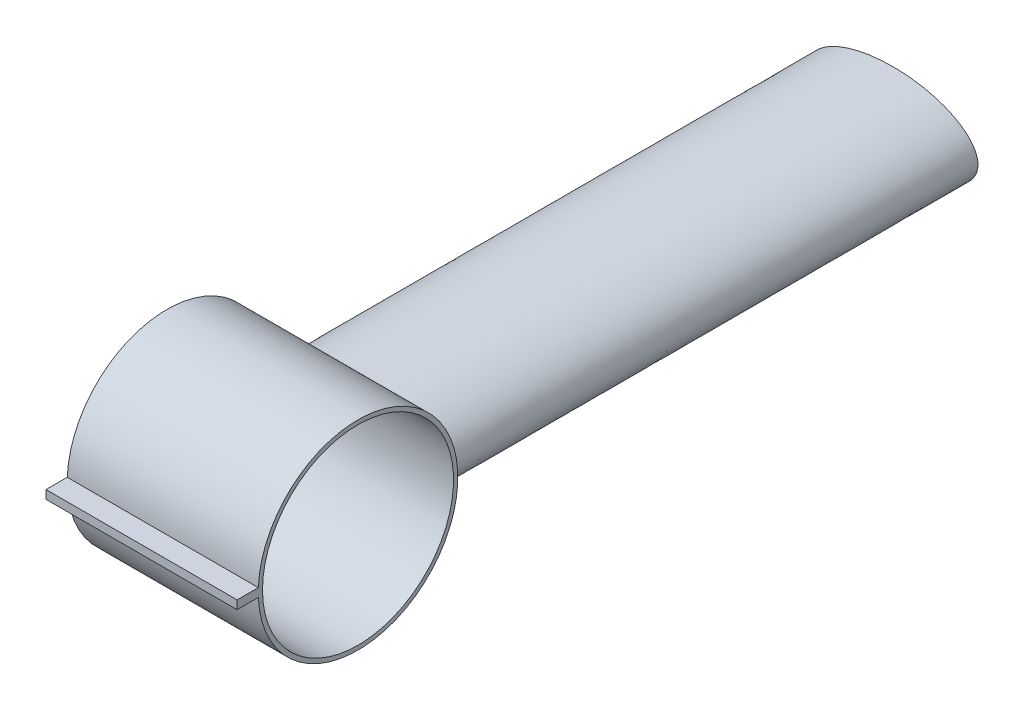
ISO-10303-21;
HEADER;
FILE_DESCRIPTION(('STEP AP214'),'2;1');
FILE_NAME('part.step','',(''),(''),'','','');
FILE_SCHEMA(('AUTOMOTIVE_DESIGN { 1 0 10303 214 1 1 1 1 }'));
ENDSEC;
DATA;
#1=APPLICATION_CONTEXT('core data for automotive mechanical design processes');
#2=APPLICATION_PROTOCOL_DEFINITION('international standard','automotive_design',2000,#1);
#3=PRODUCT_CONTEXT('',#1,'mechanical');
#4=PRODUCT('Part','Part','',(#3));
#5=PRODUCT_RELATED_PRODUCT_CATEGORY('part','',(#4));
#6=PRODUCT_DEFINITION_FORMATION('','',#4);
#7=PRODUCT_DEFINITION_CONTEXT('part definition',#1,'design');
#8=PRODUCT_DEFINITION('design','',#6,#7);
#9=PRODUCT_DEFINITION_SHAPE('','',#8);
#10=(LENGTH_UNIT() NAMED_UNIT(*) SI_UNIT(.MILLI.,.METRE.));
#11=(NAMED_UNIT(*) PLANE_ANGLE_UNIT() SI_UNIT($,.RADIAN.));
#12=(NAMED_UNIT(*) SI_UNIT($,.STERADIAN.) SOLID_ANGLE_UNIT());
#13=UNCERTAINTY_MEASURE_WITH_UNIT(LENGTH_MEASURE(1.E-05),#10,'distance_accuracy_value','');
#14=(GEOMETRIC_REPRESENTATION_CONTEXT(3) GLOBAL_UNCERTAINTY_ASSIGNED_CONTEXT((#13)) GLOBAL_UNIT_ASSIGNED_CONTEXT((#10,
#11,#12)) REPRESENTATION_CONTEXT('',''));
#15=CARTESIAN_POINT('',(0.,0.,0.));
#16=DIRECTION('',(0.,0.,1.));
#17=DIRECTION('',(1.,0.,0.));
#18=AXIS2_PLACEMENT_3D('',#15,#16,#17);
#19=CARTESIAN_POINT('',(90.,0.,0.));
#20=DIRECTION('',(-1.,0.,0.));
#21=DIRECTION('',(0.,0.,1.));
#22=AXIS2_PLACEMENT_3D('',#19,#20,#21);
#23=CYLINDRICAL_SURFACE('',#22,47.);
#24=CARTESIAN_POINT('',(0.,0.,0.));
#25=DIRECTION('',(1.,0.,0.));
#26=DIRECTION('',(0.,0.,-1.));
#27=AXIS2_PLACEMENT_3D('',#24,#25,#26);
#28=CIRCLE('',#27,47.);
#29=CARTESIAN_POINT('',(0.,-2.,46.9574275274956));
#30=VERTEX_POINT('',#29);
#31=CARTESIAN_POINT('',(0.,2.,46.9574275274956));
#32=VERTEX_POINT('',#31);
#33=EDGE_CURVE('E108',#30,#32,#28,.T.);
#34=ORIENTED_EDGE('',*,*,#33,.T.);
#35=DIRECTION('',(-1.,0.,0.));
#36=VECTOR('',#35,1.);
#37=CARTESIAN_POINT('',(90.,2.,46.9574275274956));
#38=LINE('',#37,#36);
#39=CARTESIAN_POINT('',(90.,2.,46.9574275274956));
#40=VERTEX_POINT('',#39);
#41=EDGE_CURVE('E49',#40,#32,#38,.T.);
#42=ORIENTED_EDGE('',*,*,#41,.F.);
#43=CARTESIAN_POINT('',(90.,0.,0.));
#44=DIRECTION('',(1.,0.,0.));
#45=DIRECTION('',(0.,0.,-1.));
#46=AXIS2_PLACEMENT_3D('',#43,#44,#45);
#47=CIRCLE('',#46,47.);
#48=CARTESIAN_POINT('',(90.,-2.,46.9574275274956));
#49=VERTEX_POINT('',#48);
#50=EDGE_CURVE('E94',#49,#40,#47,.T.);
#51=ORIENTED_EDGE('',*,*,#50,.F.);
#52=DIRECTION('',(-1.,0.,0.));
#53=VECTOR('',#52,1.);
#54=CARTESIAN_POINT('',(90.,-2.,46.9574275274956));
#55=LINE('',#54,#53);
#56=EDGE_CURVE('E104',#49,#30,#55,.T.);
#57=ORIENTED_EDGE('',*,*,#56,.T.);
#58=EDGE_LOOP('',(#34,#42,#51,#57));
#59=FACE_BOUND('',#58,.T.);
#60=CARTESIAN_POINT('',(85.,0.,-46.9999999999999));
#61=CARTESIAN_POINT('',(84.9999944265862,-0.301563655619714,-46.999998647965));
#62=CARTESIAN_POINT('',(84.9863196660827,-0.603234906000948,-46.9970880240753));
#63=CARTESIAN_POINT('',(84.9319724113565,-1.20415215406946,-46.9855345832595));
#64=CARTESIAN_POINT('',(84.8912821664189,-1.50339642615125,-46.9768879974824));
#65=CARTESIAN_POINT('',(84.7838668525855,-2.09766698661284,-46.9541097764554));
#66=CARTESIAN_POINT('',(84.7170809497501,-2.3926817369566,-46.9399653250412));
#67=CARTESIAN_POINT('',(84.5591106832612,-2.9758711455107,-46.9066043510303));
#68=CARTESIAN_POINT('',(84.46792021576,-3.26404407284864,-46.8873865595525));
#69=CARTESIAN_POINT('',(84.303352538782,-3.72053875255807,-46.8528290170653));
#70=CARTESIAN_POINT('',(84.2370100828878,-3.89155075866,-46.8389231696243));
#71=CARTESIAN_POINT('',(84.0965784497248,-4.23016253992002,-46.8095566530616));
#72=CARTESIAN_POINT('',(84.0224915911777,-4.39776331856755,-46.7940964493764));
#73=CARTESIAN_POINT('',(83.789264746442,-4.89533263871132,-46.74555347853));
#74=CARTESIAN_POINT('',(83.6191780360842,-5.22001465080256,-46.7103124691645));
#75=CARTESIAN_POINT('',(83.2535880656008,-5.85448119775654,-46.6350438269013));
#76=CARTESIAN_POINT('',(83.0580567918436,-6.16424878962639,-46.5950109222363));
#77=CARTESIAN_POINT('',(82.6452708087519,-6.7683281982984,-46.5111030147711));
#78=CARTESIAN_POINT('',(82.4280153488206,-7.06263948053015,-46.4672278792238));
#79=CARTESIAN_POINT('',(81.8473011294639,-7.79752765725764,-46.3508861544172));
#80=CARTESIAN_POINT('',(81.4703972767928,-8.22715679242265,-46.2762305053962));
#81=CARTESIAN_POINT('',(80.6809048959677,-9.05136741753008,-46.1221060667032));
#82=CARTESIAN_POINT('',(80.2682940315846,-9.44592665241122,-46.0426342737836));
#83=CARTESIAN_POINT('',(79.4142972707297,-10.2030966727877,-45.8807897407124));
#84=CARTESIAN_POINT('',(78.9728687398904,-10.5656581661585,-45.7984127892658));
#85=CARTESIAN_POINT('',(78.0675430521334,-11.2608348342972,-45.6324583833334));
#86=CARTESIAN_POINT('',(77.6036508639298,-11.5934565852949,-45.5488811971774));
#87=CARTESIAN_POINT('',(76.6992477714326,-12.2032982750446,-45.3890939134366));
#88=CARTESIAN_POINT('',(76.2602776850182,-12.482817424423,-45.3128834888917));
#89=CARTESIAN_POINT('',(75.3695971535917,-13.0209005759869,-45.1612032329883));
#90=CARTESIAN_POINT('',(74.9178868497776,-13.2794648102902,-45.0857333934345));
#91=CARTESIAN_POINT('',(74.0043224660932,-13.7768341342886,-44.9362455205899));
#92=CARTESIAN_POINT('',(73.5424828847854,-14.015665396096,-44.8622256669671));
#93=CARTESIAN_POINT('',(72.6096507936094,-14.4752887971383,-44.7160391586225));
#94=CARTESIAN_POINT('',(72.1386583092602,-14.6960809866587,-44.6438724987352));
#95=CARTESIAN_POINT('',(71.1897387085177,-15.1203661240045,-44.501960168481));
#96=CARTESIAN_POINT('',(70.7118270841602,-15.323892299951,-44.4322100081227));
#97=CARTESIAN_POINT('',(69.7492168752385,-15.7151276689841,-44.2953462490476));
#98=CARTESIAN_POINT('',(69.2645183081528,-15.9028369027957,-44.2282326435425));
#99=CARTESIAN_POINT('',(68.289105471902,-16.2633443494362,-44.0969437426596));
#100=CARTESIAN_POINT('',(67.7983899810034,-16.4361394747234,-44.0327690569861));
#101=CARTESIAN_POINT('',(66.8117686373278,-16.767526542864,-43.907645787306));
#102=CARTESIAN_POINT('',(66.3158624789701,-16.9261176441971,-43.8466973945293));
#103=CARTESIAN_POINT('',(64.8223753788509,-17.3812629060408,-43.6691899197874));
#104=CARTESIAN_POINT('',(63.8179457045932,-17.6575840773785,-43.5578224380648));
#105=CARTESIAN_POINT('',(61.7953423661313,-18.1603364126266,-43.3506154251185));
#106=CARTESIAN_POINT('',(60.7771700397561,-18.3867723961468,-43.2547743940587));
#107=CARTESIAN_POINT('',(58.7304944457843,-18.7928515155357,-43.0798974695963));
#108=CARTESIAN_POINT('',(57.7019948083554,-18.9725105345726,-43.0008558736066));
#109=CARTESIAN_POINT('',(55.6370112837329,-19.2874254122677,-42.8605283531815));
#110=CARTESIAN_POINT('',(54.6005270946483,-19.4226795834887,-42.799243103519));
#111=CARTESIAN_POINT('',(52.5220983357085,-19.6503792243847,-42.6951782080631));
#112=CARTESIAN_POINT('',(51.4801545026222,-19.7428303270772,-42.6523961272438));
#113=CARTESIAN_POINT('',(49.3929001044184,-19.8859997197747,-42.5858337295517));
#114=CARTESIAN_POINT('',(48.3475898403832,-19.9367216432469,-42.5620517582958));
#115=CARTESIAN_POINT('',(46.2556848019515,-19.9970042741981,-42.533762089118));
#116=CARTESIAN_POINT('',(45.2090902421753,-20.0065711141222,-42.5292515196));
#117=CARTESIAN_POINT('',(43.1161047473502,-19.9846623886487,-42.5395514750415));
#118=CARTESIAN_POINT('',(42.0697139658566,-19.9531745950618,-42.5543677565357));
#119=CARTESIAN_POINT('',(40.0805382431487,-19.8538341994039,-42.6007970654668));
#120=CARTESIAN_POINT('',(39.1375198598298,-19.7897927528591,-42.6306471911613));
#121=CARTESIAN_POINT('',(37.2549493320413,-19.627319981738,-42.7056945612138));
#122=CARTESIAN_POINT('',(36.3153975562865,-19.5288850998363,-42.7508933930804));
#123=CARTESIAN_POINT('',(34.4416184294367,-19.296710730194,-42.856192227448));
#124=CARTESIAN_POINT('',(33.5073903960814,-19.1629758751991,-42.9162902745228));
#125=CARTESIAN_POINT('',(31.6460556264533,-18.8588887405685,-43.05078371983));
#126=CARTESIAN_POINT('',(30.7189479532335,-18.6885413672316,-43.1251772022463));
#127=CARTESIAN_POINT('',(28.8763025166564,-18.3099424285319,-43.2872767436755));
#128=CARTESIAN_POINT('',(27.9607401082314,-18.1017954254721,-43.3749459705162));
#129=CARTESIAN_POINT('',(26.1412922855269,-17.6450083537636,-43.5627674773164));
#130=CARTESIAN_POINT('',(25.237403663801,-17.3963796746619,-43.6629162442943));
#131=CARTESIAN_POINT('',(23.4436447284929,-16.8554240678432,-43.8745839509887));
#132=CARTESIAN_POINT('',(22.5537810696166,-16.5630770475728,-43.9861081112006));
#133=CARTESIAN_POINT('',(20.7919419108967,-15.9306855708834,-44.219081028129));
#134=CARTESIAN_POINT('',(19.9199727433205,-15.5906245526439,-44.3405332247917));
#135=CARTESIAN_POINT('',(18.6291283828523,-15.0407502596886,-44.5287907073854));
#136=CARTESIAN_POINT('',(18.2013544978157,-14.8506559954554,-44.5926112745526));
#137=CARTESIAN_POINT('',(17.3525894134621,-14.4564548155555,-44.7219634369799));
#138=CARTESIAN_POINT('',(16.9315976667167,-14.2523490379124,-44.7874948930133));
#139=CARTESIAN_POINT('',(16.0977328981988,-13.8294191774562,-44.9198865978773));
#140=CARTESIAN_POINT('',(15.6848532921317,-13.6106077273254,-44.9867456723102));
#141=CARTESIAN_POINT('',(14.8680592216682,-13.1571143900099,-45.1214617932154));
#142=CARTESIAN_POINT('',(14.4641443853015,-12.9224331629424,-45.189318798086));
#143=CARTESIAN_POINT('',(13.7510140223661,-12.4874618102998,-45.3111789905805));
#144=CARTESIAN_POINT('',(13.4398218028596,-12.2903823139684,-45.3650799469686));
#145=CARTESIAN_POINT('',(12.8248265849565,-11.8850440259567,-45.4729559261328));
#146=CARTESIAN_POINT('',(12.5210231665271,-11.6767858719206,-45.5269309445137));
#147=CARTESIAN_POINT('',(11.9210296132352,-11.2478491210567,-45.6347995722824));
#148=CARTESIAN_POINT('',(11.6248617898409,-11.027139069104,-45.6886925867851));
#149=CARTESIAN_POINT('',(11.0422523442742,-10.5731067684566,-45.7958928894538));
#150=CARTESIAN_POINT('',(10.7558106413056,-10.3397846245739,-45.849200182483));
#151=CARTESIAN_POINT('',(10.0632816104712,-9.74795614221255,-45.9794220510677));
#152=CARTESIAN_POINT('',(9.66358921844953,-9.38174824759422,-46.0557709558769));
#153=CARTESIAN_POINT('',(8.89399372579378,-8.61812012338825,-46.2047554832693));
#154=CARTESIAN_POINT('',(8.52410263356,-8.2206874379543,-46.2773896047218));
#155=CARTESIAN_POINT('',(7.82308153897583,-7.39391098036452,-46.4166464457637));
#156=CARTESIAN_POINT('',(7.49182268378777,-6.96468158193644,-46.4832889685902));
#157=CARTESIAN_POINT('',(7.03062213520065,-6.29580251239599,-46.5769627320162));
#158=CARTESIAN_POINT('',(6.8828858529593,-6.06876118435615,-46.6071287321936));
#159=CARTESIAN_POINT('',(6.60059371848166,-5.60623454909547,-46.6650239964002));
#160=CARTESIAN_POINT('',(6.46603987009428,-5.37074796552863,-46.6927528899015));
#161=CARTESIAN_POINT('',(6.19868066521406,-4.86713634476318,-46.7480643520269));
#162=CARTESIAN_POINT('',(6.06745638704886,-4.59813368406514,-46.7753429408536));
#163=CARTESIAN_POINT('',(5.82509143819001,-4.05094018046567,-46.8259044937399));
#164=CARTESIAN_POINT('',(5.71394350682806,-3.7727527025043,-46.8491889021524));
#165=CARTESIAN_POINT('',(5.51387938018982,-3.20836671394953,-46.8912184565973));
#166=CARTESIAN_POINT('',(5.42494563589765,-2.92217472688286,-46.9099671854062));
#167=CARTESIAN_POINT('',(5.27115354708127,-2.34307254180351,-46.9424551125821));
#168=CARTESIAN_POINT('',(5.20629557742695,-2.05016223925925,-46.9561942329472));
#169=CARTESIAN_POINT('',(5.10189599123534,-1.45753232932346,-46.9783365993622));
#170=CARTESIAN_POINT('',(5.06253337973429,-1.15777955354597,-46.9867021135614));
#171=CARTESIAN_POINT('',(5.01091196178863,-0.555832160531082,-46.9976770932727));
#172=CARTESIAN_POINT('',(4.99865285185167,-0.253637570673994,-47.0002866232376));
#173=CARTESIAN_POINT('',(5.00158235168595,0.350633079844731,-46.999663333517));
#174=CARTESIAN_POINT('',(5.01677305384105,0.652709129714993,-46.9964300684597));
#175=CARTESIAN_POINT('',(5.07418116164882,1.25414704007024,-46.984226981532));
#176=CARTESIAN_POINT('',(5.11639796031713,1.55350896135922,-46.9752572884971));
#177=CARTESIAN_POINT('',(5.22222562916041,2.12301890086996,-46.9528200775174));
#178=CARTESIAN_POINT('',(5.28381797589585,2.3935632197148,-46.939777550291));
#179=CARTESIAN_POINT('',(5.42754582839735,2.92884624929271,-46.9094204081563));
#180=CARTESIAN_POINT('',(5.50967962164193,3.1935854419936,-46.8921061493799));
#181=CARTESIAN_POINT('',(5.69296472942062,3.71613131705082,-46.8535914282553));
#182=CARTESIAN_POINT('',(5.79411950322668,3.97393672862355,-46.8323902590273));
#183=CARTESIAN_POINT('',(6.01377674482036,4.4817553027793,-46.7865248825737));
#184=CARTESIAN_POINT('',(6.13228359933625,4.7317664754809,-46.7618597997109));
#185=CARTESIAN_POINT('',(6.45293835440484,5.35568333277929,-46.6954085989936));
#186=CARTESIAN_POINT('',(6.66578926796066,5.72389732647068,-46.6515494021397));
#187=CARTESIAN_POINT('',(7.1227162028139,6.43965583717111,-46.5581495277265));
#188=CARTESIAN_POINT('',(7.36680739826118,6.78719018861029,-46.5086060904152));
#189=CARTESIAN_POINT('',(7.8816604876967,7.46244532951476,-46.4050521535883));
#190=CARTESIAN_POINT('',(8.15248589476895,7.79011579782679,-46.3510310676772));
#191=CARTESIAN_POINT('',(8.71593702508617,8.42540480563648,-46.2397724257602));
#192=CARTESIAN_POINT('',(9.00856175687655,8.73302425588236,-46.1825350160648));
#193=CARTESIAN_POINT('',(9.6501840838645,9.36692464708594,-46.0584175477217));
#194=CARTESIAN_POINT('',(10.0016338809383,9.69065605045628,-45.9912326097476));
#195=CARTESIAN_POINT('',(10.7237906879406,10.315800401187,-45.8550612759004));
#196=CARTESIAN_POINT('',(11.0945093348807,10.617199588632,-45.78607380423));
#197=CARTESIAN_POINT('',(11.8518897944212,11.1991624493137,-45.6472152519121));
#198=CARTESIAN_POINT('',(12.2385557301236,11.4797206810243,-45.5773439460315));
#199=CARTESIAN_POINT('',(13.0256965349272,12.0217844084078,-45.4373760646746));
#200=CARTESIAN_POINT('',(13.4261889081313,12.2832643429427,-45.3672793137466));
#201=CARTESIAN_POINT('',(14.2383147003795,12.7880633527231,-45.227579964549));
#202=CARTESIAN_POINT('',(14.649944218348,13.0313886776901,-45.1579772037594));
#203=CARTESIAN_POINT('',(15.482793313216,13.5011898087287,-45.0197488651226));
#204=CARTESIAN_POINT('',(15.9040121841435,13.727666849972,-44.9511232159407));
#205=CARTESIAN_POINT('',(16.9200242823341,14.2498490058054,-44.7888711624617));
#206=CARTESIAN_POINT('',(17.5186727736852,14.5382645504169,-44.6958903156502));
#207=CARTESIAN_POINT('',(18.7290608495913,15.0872897033071,-44.5135628558859));
#208=CARTESIAN_POINT('',(19.3408005743457,15.347899013618,-44.4242162818839));
#209=CARTESIAN_POINT('',(20.5743374108444,15.8430716282958,-44.2500378767813));
#210=CARTESIAN_POINT('',(21.1961194794342,16.0776703776113,-44.1651999858638));
#211=CARTESIAN_POINT('',(22.4488042607839,16.522969589079,-44.0005432127864));
#212=CARTESIAN_POINT('',(23.0797068906527,16.7336702682725,-43.9207242850475));
#213=CARTESIAN_POINT('',(24.3481612255445,17.1322919526873,-43.7667697094132));
#214=CARTESIAN_POINT('',(24.9857000665032,17.3202504138144,-43.6926247926859));
#215=CARTESIAN_POINT('',(26.2672882971595,17.674996010713,-43.5503275168762));
#216=CARTESIAN_POINT('',(26.9113376816431,17.8417831634382,-43.482175152995));
#217=CARTESIAN_POINT('',(28.2051249139284,18.1552264976946,-43.3522379299203));
#218=CARTESIAN_POINT('',(28.8548642169649,18.301877359194,-43.2904547545442));
#219=CARTESIAN_POINT('',(30.1590005639285,18.57582397977,-43.1736137592337));
#220=CARTESIAN_POINT('',(30.8133976026053,18.7031197606603,-43.1185559317197));
#221=CARTESIAN_POINT('',(32.1255563221577,18.9389437641581,-43.0154968788587));
#222=CARTESIAN_POINT('',(32.7833147860459,19.047487365648,-42.9674898759373));
#223=CARTESIAN_POINT('',(34.1020590447414,19.2464875424336,-42.878718460427));
#224=CARTESIAN_POINT('',(34.7630450072356,19.336943167489,-42.8379544283554));
#225=CARTESIAN_POINT('',(36.749679523769,19.5818399578881,-42.7268572880518));
#226=CARTESIAN_POINT('',(38.0793166200119,19.7098665293631,-42.6676944770313));
#227=CARTESIAN_POINT('',(40.7440403038467,19.8978431044334,-42.5803514692308));
#228=CARTESIAN_POINT('',(42.0791258475219,19.9578055861793,-42.5521655934971));
#229=CARTESIAN_POINT('',(44.7509971415528,20.0107817035076,-42.52727980944));
#230=CARTESIAN_POINT('',(46.087782960671,20.0037925394056,-42.5305812178049));
#231=CARTESIAN_POINT('',(48.7589274039557,19.9227318480772,-42.5686117885335));
#232=CARTESIAN_POINT('',(50.0932858861475,19.8486565158709,-42.6033427335111));
#233=CARTESIAN_POINT('',(52.7553039626024,19.6320784660389,-42.7035829246577));
#234=CARTESIAN_POINT('',(54.0829640597834,19.48958096523,-42.7690898243198));
#235=CARTESIAN_POINT('',(56.0659471913049,19.2224675548328,-42.8894619772112));
#236=CARTESIAN_POINT('',(56.7256400647823,19.1245130997297,-42.9332810697826));
#237=CARTESIAN_POINT('',(58.0415202882659,18.9102991386349,-43.028065231815));
#238=CARTESIAN_POINT('',(58.697707826454,18.7940406257071,-43.0790299135846));
#239=CARTESIAN_POINT('',(60.0061083667224,18.5425732271905,-43.1878656257211));
#240=CARTESIAN_POINT('',(60.6583198867429,18.4073576781657,-43.2457390834695));
#241=CARTESIAN_POINT('',(61.957741220228,18.1172660634488,-43.3680696339315));
#242=CARTESIAN_POINT('',(62.604951059628,17.9623900997754,-43.4325266924822));
#243=CARTESIAN_POINT('',(63.8943280469634,17.6318602285377,-43.5677568912269));
#244=CARTESIAN_POINT('',(64.5364872257761,17.4561786071491,-43.6385384243258));
#245=CARTESIAN_POINT('',(65.8138323479053,17.0831168051218,-43.785926529296));
#246=CARTESIAN_POINT('',(66.4490181089765,16.8857360588691,-43.8625332529919));
#247=CARTESIAN_POINT('',(67.7105627190323,16.4681670915734,-44.0210098290628));
#248=CARTESIAN_POINT('',(68.3369289248352,16.2479993375566,-44.1028749337687));
#249=CARTESIAN_POINT('',(69.5798470101852,15.783167453446,-44.271354081312));
#250=CARTESIAN_POINT('',(70.1963997144524,15.5385053945698,-44.3579677223375));
#251=CARTESIAN_POINT('',(71.1981539015811,15.1155428240997,-44.5033794447415));
#252=CARTESIAN_POINT('',(71.5868233192645,14.9450155504302,-44.5609800965924));
#253=CARTESIAN_POINT('',(72.358735826494,14.592573418742,-44.6776373169887));
#254=CARTESIAN_POINT('',(72.7419791534492,14.410659060845,-44.7366938215241));
#255=CARTESIAN_POINT('',(73.5030353813513,14.0344562536295,-44.856137448111));
#256=CARTESIAN_POINT('',(73.8808370921649,13.8401458220541,-44.9165268023613));
#257=CARTESIAN_POINT('',(74.6294059580879,13.4387446347058,-45.0382514779079));
#258=CARTESIAN_POINT('',(75.0001734418919,13.2316544780351,-45.0995867547591));
#259=CARTESIAN_POINT('',(75.9282195397603,12.690443429372,-45.2555953279917));
#260=CARTESIAN_POINT('',(76.4801585451454,12.3471866494633,-45.3507022645314));
#261=CARTESIAN_POINT('',(77.5608466019724,11.6254522328935,-45.5410607569906));
#262=CARTESIAN_POINT('',(78.0895878229079,11.2469628358707,-45.636312350684));
#263=CARTESIAN_POINT('',(79.1163976109515,10.4518592817083,-45.8249423910133));
#264=CARTESIAN_POINT('',(79.6145321701359,10.0353323364016,-45.9183245524131));
#265=CARTESIAN_POINT('',(80.3328442025743,9.3786770259833,-46.0552949258815));
#266=CARTESIAN_POINT('',(80.5674060551684,9.15454710559669,-46.1004225908469));
#267=CARTESIAN_POINT('',(81.025575483953,8.69513772606408,-46.1892775463559));
#268=CARTESIAN_POINT('',(81.2491825899653,8.45985778921003,-46.233004776765));
#269=CARTESIAN_POINT('',(81.9313402688018,7.70316416104641,-46.3673976626656));
#270=CARTESIAN_POINT('',(82.3679550186348,7.16057373124053,-46.4549042107713));
#271=CARTESIAN_POINT('',(82.9651223321636,6.30504933341354,-46.5760587523717));
#272=CARTESIAN_POINT('',(83.1546295620869,6.01278408120999,-46.6147755790589));
#273=CARTESIAN_POINT('',(83.5114383872639,5.41431118795536,-46.6880726824702));
#274=CARTESIAN_POINT('',(83.6787366641138,5.10810147251845,-46.7226523409533));
#275=CARTESIAN_POINT('',(83.9900386332564,4.47784434882617,-46.7872918499093));
#276=CARTESIAN_POINT('',(84.1336623946279,4.1536004737017,-46.8172775221503));
#277=CARTESIAN_POINT('',(84.3909285600107,3.49310822406991,-46.8711841269004));
#278=CARTESIAN_POINT('',(84.504589667649,3.15686748793626,-46.8951088424828));
#279=CARTESIAN_POINT('',(84.6983482640858,2.47550839918431,-46.9359965775623));
#280=CARTESIAN_POINT('',(84.778557305571,2.13042369247357,-46.9529827311371));
#281=CARTESIAN_POINT('',(84.8720339813861,1.60805918297868,-46.9728068703706));
#282=CARTESIAN_POINT('',(84.8987163943895,1.43319701450455,-46.9784716177523));
#283=CARTESIAN_POINT('',(84.9429371958676,1.08227272380438,-46.9878649715163));
#284=CARTESIAN_POINT('',(84.9604770410635,0.906210797272142,-46.991593886342));
#285=CARTESIAN_POINT('',(84.9822270615987,0.608397083952204,-46.9962190505169));
#286=CARTESIAN_POINT('',(84.9888881510003,0.486826458320001,-46.9976359885745));
#287=CARTESIAN_POINT('',(84.997775963221,0.243509746355741,-46.9995267825995));
#288=CARTESIAN_POINT('',(85.0000022504011,0.121763643961678,-47.0000005459169));
#289=CARTESIAN_POINT('',(85.,0.,-46.9999999999999));
#290=B_SPLINE_CURVE_WITH_KNOTS('',3,(#60,#61,#62,#63,#64,#65,#66,#67,#68,#69,#70,#71,#72,#73,
#74,#75,#76,#77,#78,#79,#80,#81,#82,#83,#84,#85,#86,#87,#88,#89,#90,#91,#92,#93,#94,#95,#96,#97,
#98,#99,#100,#101,#102,#103,#104,#105,#106,#107,#108,#109,#110,#111,#112,#113,#114,#115,#116,
#117,#118,#119,#120,#121,#122,#123,#124,#125,#126,#127,#128,#129,#130,#131,#132,#133,#134,#135,
#136,#137,#138,#139,#140,#141,#142,#143,#144,#145,#146,#147,#148,#149,#150,#151,#152,#153,#154,
#155,#156,#157,#158,#159,#160,#161,#162,#163,#164,#165,#166,#167,#168,#169,#170,#171,#172,#173,
#174,#175,#176,#177,#178,#179,#180,#181,#182,#183,#184,#185,#186,#187,#188,#189,#190,#191,#192,
#193,#194,#195,#196,#197,#198,#199,#200,#201,#202,#203,#204,#205,#206,#207,#208,#209,#210,#211,
#212,#213,#214,#215,#216,#217,#218,#219,#220,#221,#222,#223,#224,#225,#226,#227,#228,#229,#230,
#231,#232,#233,#234,#235,#236,#237,#238,#239,#240,#241,#242,#243,#244,#245,#246,#247,#248,#249,
#250,#251,#252,#253,#254,#255,#256,#257,#258,#259,#260,#261,#262,#263,#264,#265,#266,#267,#268,
#269,#270,#271,#272,#273,#274,#275,#276,#277,#278,#279,#280,#281,#282,#283,#284,#285,#286,#287,
#288,#289),.UNSPECIFIED.,.T.,.F.,(4,2,2,2,2,2,2,2,2,2,2,2,2,2,2,2,2,2,2,2,2,2,2,2,2,2,2,2,2,2,2,
2,2,2,2,2,2,2,2,2,2,2,2,2,2,2,2,2,2,2,2,2,2,2,2,2,2,2,2,2,2,2,2,2,2,2,2,2,2,2,2,2,2,2,2,2,2,2,2,
2,2,2,2,2,2,2,2,2,2,2,2,2,2,2,2,2,2,2,2,2,2,2,2,2,2,2,2,2,2,2,2,2,2,2,4),(0.,0.904559151674308,
1.80971323929991,2.71699012459969,3.6244941421552,4.17617445677965,4.7276900654884,
5.83089199450221,6.935318954615,8.03978408720933,9.76610929973625,11.493522316641,
13.2235515627633,14.9531998779249,16.5304614715309,18.1077055914214,19.682823038202,
21.2579360940591,22.8299456511093,24.4019511604656,25.9742813321216,27.5467045952729,
30.6880782395804,33.8291482498478,36.9691503113907,40.1092716829495,43.2489796871825,
46.3884142800052,49.5273810551201,52.6672829902188,55.5035386838416,58.3400878192785,
61.1762648727535,64.0120620980656,66.8401311593186,69.6674059119959,72.4959840708172,
75.3255464865194,76.7426554279729,78.1596494068487,79.5754413246249,80.9911743874797,
82.1077741050828,83.2243101980356,84.3438054514658,85.4632914028282,87.1040567708781,
88.7454800108345,90.381261657192,91.1985327355969,92.0159278544505,92.916776576585,
93.817298849029,94.717107450542,95.6169300618638,96.5230038175078,97.4290674273101,
98.3352001054488,99.2413124332916,100.073753164277,100.906124518565,101.738647399671,
102.571381112979,103.852026295806,105.133295896181,106.417686253113,107.702018230338,
109.148549018495,110.595963795095,112.043755169672,113.493451973091,114.942647393656,
116.391736466711,118.403823618579,120.415932329527,122.425264508034,124.434578436413,
126.440536676422,128.446493310079,130.452978904251,132.459462237039,134.464292136185,
136.469227330121,140.478145861192,144.486329320764,148.49468038932,152.503258816967,
156.51153166091,158.516379881857,160.521119369729,162.526565302551,164.532000829457,
166.540138361798,168.548328251098,170.554729808387,172.560961849141,173.845769853397,
175.130521468329,176.417618350563,177.704654940605,179.674082106163,181.644169024014,
183.609847238574,184.592146342949,185.574487570774,187.673729980795,188.724362702317,
189.775152230369,190.841438594925,191.907057765478,192.969094437547,193.499819926243,
194.030460826503,194.395662662111,194.760900370417),.UNSPECIFIED.);
#291=CARTESIAN_POINT('',(85.,0.,-46.9999999999999));
#292=VERTEX_POINT('',#291);
#293=EDGE_CURVE('E11',#292,#292,#290,.T.);
#294=ORIENTED_EDGE('',*,*,#293,.F.);
#295=EDGE_LOOP('',(#294));
#296=FACE_BOUND('',#295,.T.);
#297=ADVANCED_FACE('F36',(#59,#296),#23,.T.);
#298=CARTESIAN_POINT('',(90.,0.,0.));
#299=DIRECTION('',(1.,0.,0.));
#300=DIRECTION('',(0.,0.,-1.));
#301=AXIS2_PLACEMENT_3D('',#298,#299,#300);
#302=PLANE('',#301);
#303=ORIENTED_EDGE('',*,*,#50,.T.);
#304=DIRECTION('',(0.,0.,1.));
#305=VECTOR('',#304,1.);
#306=CARTESIAN_POINT('',(90.,2.,56.9574275274956));
#307=LINE('',#306,#305);
#308=CARTESIAN_POINT('',(90.,2.,56.9574275274956));
#309=VERTEX_POINT('',#308);
#310=EDGE_CURVE('E88',#40,#309,#307,.T.);
#311=ORIENTED_EDGE('',*,*,#310,.T.);
#312=DIRECTION('',(0.,-1.,0.));
#313=VECTOR('',#312,1.);
#314=CARTESIAN_POINT('',(90.,-2.,56.9574275274956));
#315=LINE('',#314,#313);
#316=CARTESIAN_POINT('',(90.,-2.,56.9574275274956));
#317=VERTEX_POINT('',#316);
#318=EDGE_CURVE('E92',#309,#317,#315,.T.);
#319=ORIENTED_EDGE('',*,*,#318,.T.);
#320=DIRECTION('',(0.,0.,-1.));
#321=VECTOR('',#320,1.);
#322=CARTESIAN_POINT('',(90.,-2.,56.9574275274956));
#323=LINE('',#322,#321);
#324=EDGE_CURVE('E57',#317,#49,#323,.T.);
#325=ORIENTED_EDGE('',*,*,#324,.T.);
#326=EDGE_LOOP('',(#303,#311,#319,#325));
#327=FACE_BOUND('',#326,.T.);
#328=CARTESIAN_POINT('',(90.,0.,0.));
#329=DIRECTION('',(1.,0.,0.));
#330=DIRECTION('',(0.,0.,-1.));
#331=AXIS2_PLACEMENT_3D('',#328,#329,#330);
#332=CIRCLE('',#331,45.);
#333=CARTESIAN_POINT('',(90.,0.,45.));
#334=VERTEX_POINT('',#333);
#335=EDGE_CURVE('E111',#334,#334,#332,.T.);
#336=ORIENTED_EDGE('',*,*,#335,.F.);
#337=EDGE_LOOP('',(#336));
#338=FACE_BOUND('',#337,.T.);
#339=ADVANCED_FACE('F89',(#327,#338),#302,.T.);
#340=CARTESIAN_POINT('',(0.,0.,0.));
#341=DIRECTION('',(1.,0.,0.));
#342=DIRECTION('',(0.,0.,-1.));
#343=AXIS2_PLACEMENT_3D('',#340,#341,#342);
#344=PLANE('',#343);
#345=ORIENTED_EDGE('',*,*,#33,.F.);
#346=DIRECTION('',(0.,0.,-1.));
#347=VECTOR('',#346,1.);
#348=CARTESIAN_POINT('',(0.,-2.,56.9574275274956));
#349=LINE('',#348,#347);
#350=CARTESIAN_POINT('',(0.,-2.,56.9574275274956));
#351=VERTEX_POINT('',#350);
#352=EDGE_CURVE('E80',#351,#30,#349,.T.);
#353=ORIENTED_EDGE('',*,*,#352,.F.);
#354=DIRECTION('',(0.,-1.,0.));
#355=VECTOR('',#354,1.);
#356=CARTESIAN_POINT('',(0.,-2.,56.9574275274956));
#357=LINE('',#356,#355);
#358=CARTESIAN_POINT('',(0.,2.,56.9574275274956));
#359=VERTEX_POINT('',#358);
#360=EDGE_CURVE('E74',#359,#351,#357,.T.);
#361=ORIENTED_EDGE('',*,*,#360,.F.);
#362=DIRECTION('',(0.,0.,1.));
#363=VECTOR('',#362,1.);
#364=CARTESIAN_POINT('',(0.,2.,56.9574275274956));
#365=LINE('',#364,#363);
#366=EDGE_CURVE('E99',#32,#359,#365,.T.);
#367=ORIENTED_EDGE('',*,*,#366,.F.);
#368=EDGE_LOOP('',(#345,#353,#361,#367));
#369=FACE_BOUND('',#368,.T.);
#370=CARTESIAN_POINT('',(0.,0.,0.));
#371=DIRECTION('',(1.,0.,0.));
#372=DIRECTION('',(0.,0.,-1.));
#373=AXIS2_PLACEMENT_3D('',#370,#371,#372);
#374=CIRCLE('',#373,45.);
#375=CARTESIAN_POINT('',(0.,0.,45.));
#376=VERTEX_POINT('',#375);
#377=EDGE_CURVE('E126',#376,#376,#374,.T.);
#378=ORIENTED_EDGE('',*,*,#377,.T.);
#379=EDGE_LOOP('',(#378));
#380=FACE_BOUND('',#379,.T.);
#381=ADVANCED_FACE('F120',(#369,#380),#344,.F.);
#382=CARTESIAN_POINT('',(90.,2.,56.9574275274956));
#383=DIRECTION('',(0.,-1.,0.));
#384=DIRECTION('',(0.,0.,-1.));
#385=AXIS2_PLACEMENT_3D('',#382,#383,#384);
#386=PLANE('',#385);
#387=ORIENTED_EDGE('',*,*,#366,.T.);
#388=DIRECTION('',(-1.,0.,0.));
#389=VECTOR('',#388,1.);
#390=CARTESIAN_POINT('',(90.,2.,56.9574275274956));
#391=LINE('',#390,#389);
#392=EDGE_CURVE('E97',#309,#359,#391,.T.);
#393=ORIENTED_EDGE('',*,*,#392,.F.);
#394=ORIENTED_EDGE('',*,*,#310,.F.);
#395=ORIENTED_EDGE('',*,*,#41,.T.);
#396=EDGE_LOOP('',(#387,#393,#394,#395));
#397=FACE_BOUND('',#396,.T.);
#398=ADVANCED_FACE('F98',(#397),#386,.F.);
#399=CARTESIAN_POINT('',(90.,-2.,56.9574275274956));
#400=DIRECTION('',(0.,0.,-1.));
#401=DIRECTION('',(0.,1.,0.));
#402=AXIS2_PLACEMENT_3D('',#399,#400,#401);
#403=PLANE('',#402);
#404=ORIENTED_EDGE('',*,*,#360,.T.);
#405=DIRECTION('',(-1.,0.,0.));
#406=VECTOR('',#405,1.);
#407=CARTESIAN_POINT('',(90.,-2.,56.9574275274956));
#408=LINE('',#407,#406);
#409=EDGE_CURVE('E100',#317,#351,#408,.T.);
#410=ORIENTED_EDGE('',*,*,#409,.F.);
#411=ORIENTED_EDGE('',*,*,#318,.F.);
#412=ORIENTED_EDGE('',*,*,#392,.T.);
#413=EDGE_LOOP('',(#404,#410,#411,#412));
#414=FACE_BOUND('',#413,.T.);
#415=ADVANCED_FACE('F102',(#414),#403,.F.);
#416=CARTESIAN_POINT('',(90.,-2.,56.9574275274956));
#417=DIRECTION('',(0.,1.,0.));
#418=DIRECTION('',(0.,0.,1.));
#419=AXIS2_PLACEMENT_3D('',#416,#417,#418);
#420=PLANE('',#419);
#421=ORIENTED_EDGE('',*,*,#352,.T.);
#422=ORIENTED_EDGE('',*,*,#56,.F.);
#423=ORIENTED_EDGE('',*,*,#324,.F.);
#424=ORIENTED_EDGE('',*,*,#409,.T.);
#425=EDGE_LOOP('',(#421,#422,#423,#424));
#426=FACE_BOUND('',#425,.T.);
#427=ADVANCED_FACE('F145',(#426),#420,.F.);
#428=CARTESIAN_POINT('',(90.,0.,0.));
#429=DIRECTION('',(-1.,0.,0.));
#430=DIRECTION('',(0.,0.,1.));
#431=AXIS2_PLACEMENT_3D('',#428,#429,#430);
#432=CYLINDRICAL_SURFACE('',#431,45.);
#433=CARTESIAN_POINT('',(90.,0.,45.));
#434=CARTESIAN_POINT('',(89.0625,0.,45.));
#435=CARTESIAN_POINT('',(88.125,0.,45.));
#436=CARTESIAN_POINT('',(86.25,0.,45.));
#437=CARTESIAN_POINT('',(85.3125,0.,45.));
#438=CARTESIAN_POINT('',(83.4375,0.,45.));
#439=CARTESIAN_POINT('',(82.5,0.,45.));
#440=CARTESIAN_POINT('',(80.625,0.,45.));
#441=CARTESIAN_POINT('',(79.6875,0.,45.));
#442=CARTESIAN_POINT('',(77.8125,0.,45.));
#443=CARTESIAN_POINT('',(76.875,0.,45.));
#444=CARTESIAN_POINT('',(75.,0.,45.));
#445=CARTESIAN_POINT('',(74.0625,0.,45.));
#446=CARTESIAN_POINT('',(72.1875,0.,45.));
#447=CARTESIAN_POINT('',(71.25,0.,45.));
#448=CARTESIAN_POINT('',(69.375,0.,45.));
#449=CARTESIAN_POINT('',(68.4375,0.,45.));
#450=CARTESIAN_POINT('',(66.5625,0.,45.));
#451=CARTESIAN_POINT('',(65.625,0.,45.));
#452=CARTESIAN_POINT('',(63.75,0.,45.));
#453=CARTESIAN_POINT('',(62.8125,0.,45.));
#454=CARTESIAN_POINT('',(60.9375,0.,45.));
#455=CARTESIAN_POINT('',(60.,0.,45.));
#456=CARTESIAN_POINT('',(58.125,0.,45.));
#457=CARTESIAN_POINT('',(57.1875,0.,45.));
#458=CARTESIAN_POINT('',(55.3125,0.,45.));
#459=CARTESIAN_POINT('',(54.375,0.,45.));
#460=CARTESIAN_POINT('',(52.5,0.,45.));
#461=CARTESIAN_POINT('',(51.5625,0.,45.));
#462=CARTESIAN_POINT('',(49.6875,0.,45.));
#463=CARTESIAN_POINT('',(48.75,0.,45.));
#464=CARTESIAN_POINT('',(46.875,0.,45.));
#465=CARTESIAN_POINT('',(45.9375,0.,45.));
#466=CARTESIAN_POINT('',(44.0625,0.,45.));
#467=CARTESIAN_POINT('',(43.125,0.,45.));
#468=CARTESIAN_POINT('',(41.25,0.,45.));
#469=CARTESIAN_POINT('',(40.3125,0.,45.));
#470=CARTESIAN_POINT('',(38.4375,0.,45.));
#471=CARTESIAN_POINT('',(37.5,0.,45.));
#472=CARTESIAN_POINT('',(35.625,0.,45.));
#473=CARTESIAN_POINT('',(34.6875,0.,45.));
#474=CARTESIAN_POINT('',(32.8125,0.,45.));
#475=CARTESIAN_POINT('',(31.875,0.,45.));
#476=CARTESIAN_POINT('',(30.,0.,45.));
#477=CARTESIAN_POINT('',(29.0625,0.,45.));
#478=CARTESIAN_POINT('',(27.1875,0.,45.));
#479=CARTESIAN_POINT('',(26.25,0.,45.));
#480=CARTESIAN_POINT('',(24.375,0.,45.));
#481=CARTESIAN_POINT('',(23.4375,0.,45.));
#482=CARTESIAN_POINT('',(21.5625,0.,45.));
#483=CARTESIAN_POINT('',(20.625,0.,45.));
#484=CARTESIAN_POINT('',(18.75,0.,45.));
#485=CARTESIAN_POINT('',(17.8125,0.,45.));
#486=CARTESIAN_POINT('',(15.9375,0.,45.));
#487=CARTESIAN_POINT('',(15.,0.,45.));
#488=CARTESIAN_POINT('',(13.125,0.,45.));
#489=CARTESIAN_POINT('',(12.1875,0.,45.));
#490=CARTESIAN_POINT('',(10.3125,0.,45.));
#491=CARTESIAN_POINT('',(9.37499999999999,0.,45.));
#492=CARTESIAN_POINT('',(7.49999999999999,0.,45.));
#493=CARTESIAN_POINT('',(6.56249999999999,0.,45.));
#494=CARTESIAN_POINT('',(4.68749999999999,0.,45.));
#495=CARTESIAN_POINT('',(3.74999999999998,0.,45.));
#496=CARTESIAN_POINT('',(1.87499999999998,0.,45.));
#497=CARTESIAN_POINT('',(0.937499999999986,0.,45.));
#498=CARTESIAN_POINT('',(0.,0.,45.));
#499=B_SPLINE_CURVE_WITH_KNOTS('',3,(#433,#434,#435,#436,#437,#438,#439,#440,#441,#442,#443,
#444,#445,#446,#447,#448,#449,#450,#451,#452,#453,#454,#455,#456,#457,#458,#459,#460,#461,#462,
#463,#464,#465,#466,#467,#468,#469,#470,#471,#472,#473,#474,#475,#476,#477,#478,#479,#480,#481,
#482,#483,#484,#485,#486,#487,#488,#489,#490,#491,#492,#493,#494,#495,#496,#497,#498),
.UNSPECIFIED.,.F.,.F.,(4,2,2,2,2,2,2,2,2,2,2,2,2,2,2,2,2,2,2,2,2,2,2,2,2,2,2,2,2,2,2,2,4),(0.,
2.81250000000001,5.62500000000001,8.43750000000001,11.25,14.0625,16.875,19.6875,22.5,25.3125,
28.125,30.9375,33.75,36.5625,39.375,42.1875,45.,47.8125,50.625,53.4375,56.25,59.0625,61.875,
64.6875,67.5,70.3125,73.125,75.9375,78.75,81.5625,84.375,87.1875,90.),.UNSPECIFIED.);
#500=EDGE_CURVE('BSEAM141',#334,#376,#499,.T.);
#501=ORIENTED_EDGE('',*,*,#335,.T.);
#502=ORIENTED_EDGE('',*,*,#377,.F.);
#503=ORIENTED_EDGE('',*,*,#500,.T.);
#504=ORIENTED_EDGE('',*,*,#500,.F.);
#505=EDGE_LOOP('',(#501,#503,#502,#504));
#506=FACE_BOUND('',#505,.T.);
#507=ADVANCED_FACE('F141',(#506),#432,.F.);
#508=CARTESIAN_POINT('',(45.,0.,-297.));
#509=DIRECTION('',(0.,0.,-1.));
#510=DIRECTION('',(1.,0.,0.));
#511=AXIS2_PLACEMENT_3D('',#508,#509,#510);
#512=ELLIPSE('',#511,40.,20.);
#513=DIRECTION('',(0.,0.,1.));
#514=VECTOR('',#513,1.);
#515=SURFACE_OF_LINEAR_EXTRUSION('',#512,#514);
#516=CARTESIAN_POINT('',(85.,0.,-297.));
#517=VERTEX_POINT('',#516);
#518=EDGE_CURVE('E128',#517,#517,#512,.T.);
#519=ORIENTED_EDGE('',*,*,#518,.F.);
#520=EDGE_LOOP('',(#519));
#521=FACE_BOUND('',#520,.T.);
#522=ORIENTED_EDGE('',*,*,#293,.T.);
#523=EDGE_LOOP('',(#522));
#524=FACE_BOUND('',#523,.T.);
#525=ADVANCED_FACE('F135',(#521,#524),#515,.F.);
#526=CARTESIAN_POINT('',(45.,0.,-297.));
#527=DIRECTION('',(0.,0.,-1.));
#528=DIRECTION('',(-1.,0.,0.));
#529=AXIS2_PLACEMENT_3D('',#526,#527,#528);
#530=PLANE('',#529);
#531=ORIENTED_EDGE('',*,*,#518,.T.);
#532=EDGE_LOOP('',(#531));
#533=FACE_BOUND('',#532,.T.);
#534=ADVANCED_FACE('F140',(#533),#530,.T.);
#535=CLOSED_SHELL('',(#297,#339,#381,#398,#415,#427,#507,#525,#534));
#536=MANIFOLD_SOLID_BREP('B2',#535);
#537=ADVANCED_BREP_SHAPE_REPRESENTATION('',(#18,#536),#14);
#538=SHAPE_DEFINITION_REPRESENTATION(#9,#537);
ENDSEC;
END-ISO-10303-21;
